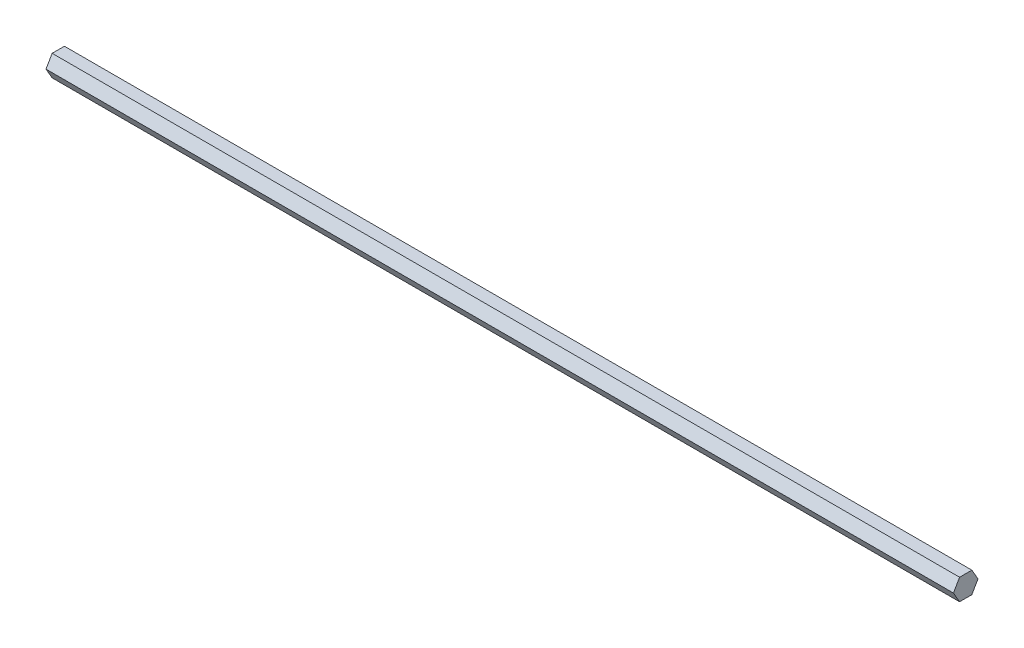
ISO-10303-21;
HEADER;
FILE_DESCRIPTION(('STEP AP214'),'2;1');
FILE_NAME('part.step','',(''),(''),'','','');
FILE_SCHEMA(('AUTOMOTIVE_DESIGN { 1 0 10303 214 1 1 1 1 }'));
ENDSEC;
DATA;
#1=APPLICATION_CONTEXT('core data for automotive mechanical design processes');
#2=APPLICATION_PROTOCOL_DEFINITION('international standard','automotive_design',2000,#1);
#3=PRODUCT_CONTEXT('',#1,'mechanical');
#4=PRODUCT('Part','Part','',(#3));
#5=PRODUCT_RELATED_PRODUCT_CATEGORY('part','',(#4));
#6=PRODUCT_DEFINITION_FORMATION('','',#4);
#7=PRODUCT_DEFINITION_CONTEXT('part definition',#1,'design');
#8=PRODUCT_DEFINITION('design','',#6,#7);
#9=PRODUCT_DEFINITION_SHAPE('','',#8);
#10=(LENGTH_UNIT() NAMED_UNIT(*) SI_UNIT(.MILLI.,.METRE.));
#11=(NAMED_UNIT(*) PLANE_ANGLE_UNIT() SI_UNIT($,.RADIAN.));
#12=(NAMED_UNIT(*) SI_UNIT($,.STERADIAN.) SOLID_ANGLE_UNIT());
#13=UNCERTAINTY_MEASURE_WITH_UNIT(LENGTH_MEASURE(1.E-05),#10,'distance_accuracy_value','');
#14=(GEOMETRIC_REPRESENTATION_CONTEXT(3) GLOBAL_UNCERTAINTY_ASSIGNED_CONTEXT((#13)) GLOBAL_UNIT_ASSIGNED_CONTEXT((#10,
#11,#12)) REPRESENTATION_CONTEXT('',''));
#15=CARTESIAN_POINT('',(0.,0.,0.));
#16=DIRECTION('',(0.,0.,1.));
#17=DIRECTION('',(1.,0.,0.));
#18=AXIS2_PLACEMENT_3D('',#15,#16,#17);
#19=CARTESIAN_POINT('',(406.4,-4.76249999999995,-2.74963065701564));
#20=DIRECTION('',(0.,0.499999999999995,0.866025403784441));
#21=DIRECTION('',(0.,-0.866025403784442,0.499999999999995));
#22=AXIS2_PLACEMENT_3D('',#19,#20,#21);
#23=PLANE('',#22);
#24=DIRECTION('',(0.,0.866025403784442,-0.499999999999995));
#25=VECTOR('',#24,1.);
#26=CARTESIAN_POINT('',(0.,-4.76249999999995,-2.74963065701564));
#27=LINE('',#26,#25);
#28=CARTESIAN_POINT('',(0.,-4.76249999999995,-2.74963065701564));
#29=VERTEX_POINT('',#28);
#30=CARTESIAN_POINT('',(0.,0.,-5.49926131403117));
#31=VERTEX_POINT('',#30);
#32=EDGE_CURVE('E120',#29,#31,#27,.T.);
#33=ORIENTED_EDGE('',*,*,#32,.T.);
#34=DIRECTION('',(-1.,0.,0.));
#35=VECTOR('',#34,1.);
#36=CARTESIAN_POINT('',(406.4,0.,-5.49926131403117));
#37=LINE('',#36,#35);
#38=CARTESIAN_POINT('',(406.4,0.,-5.49926131403117));
#39=VERTEX_POINT('',#38);
#40=EDGE_CURVE('E11',#39,#31,#37,.T.);
#41=ORIENTED_EDGE('',*,*,#40,.F.);
#42=DIRECTION('',(0.,0.866025403784442,-0.499999999999995));
#43=VECTOR('',#42,1.);
#44=CARTESIAN_POINT('',(406.4,-4.76249999999995,-2.74963065701564));
#45=LINE('',#44,#43);
#46=CARTESIAN_POINT('',(406.4,-4.76249999999995,-2.74963065701564));
#47=VERTEX_POINT('',#46);
#48=EDGE_CURVE('E130',#47,#39,#45,.T.);
#49=ORIENTED_EDGE('',*,*,#48,.F.);
#50=DIRECTION('',(-1.,0.,0.));
#51=VECTOR('',#50,1.);
#52=CARTESIAN_POINT('',(406.4,-4.76249999999995,-2.74963065701564));
#53=LINE('',#52,#51);
#54=EDGE_CURVE('E116',#47,#29,#53,.T.);
#55=ORIENTED_EDGE('',*,*,#54,.T.);
#56=EDGE_LOOP('',(#33,#41,#49,#55));
#57=FACE_BOUND('',#56,.T.);
#58=ADVANCED_FACE('F36',(#57),#23,.F.);
#59=CARTESIAN_POINT('',(406.4,0.,-5.49926131403117));
#60=DIRECTION('',(0.,-0.500000000000001,0.866025403784438));
#61=DIRECTION('',(0.,-0.866025403784438,-0.500000000000001));
#62=AXIS2_PLACEMENT_3D('',#59,#60,#61);
#63=PLANE('',#62);
#64=DIRECTION('',(0.,0.866025403784438,0.500000000000001));
#65=VECTOR('',#64,1.);
#66=CARTESIAN_POINT('',(0.,0.,-5.49926131403117));
#67=LINE('',#66,#65);
#68=CARTESIAN_POINT('',(0.,4.76249999999999,-2.74963065701557));
#69=VERTEX_POINT('',#68);
#70=EDGE_CURVE('E123',#31,#69,#67,.T.);
#71=ORIENTED_EDGE('',*,*,#70,.T.);
#72=DIRECTION('',(-1.,0.,0.));
#73=VECTOR('',#72,1.);
#74=CARTESIAN_POINT('',(406.4,4.76249999999999,-2.74963065701557));
#75=LINE('',#74,#73);
#76=CARTESIAN_POINT('',(406.4,4.76249999999999,-2.74963065701557));
#77=VERTEX_POINT('',#76);
#78=EDGE_CURVE('E44',#77,#69,#75,.T.);
#79=ORIENTED_EDGE('',*,*,#78,.F.);
#80=DIRECTION('',(0.,0.866025403784438,0.500000000000001));
#81=VECTOR('',#80,1.);
#82=CARTESIAN_POINT('',(406.4,0.,-5.49926131403117));
#83=LINE('',#82,#81);
#84=EDGE_CURVE('E89',#39,#77,#83,.T.);
#85=ORIENTED_EDGE('',*,*,#84,.F.);
#86=ORIENTED_EDGE('',*,*,#40,.T.);
#87=EDGE_LOOP('',(#71,#79,#85,#86));
#88=FACE_BOUND('',#87,.T.);
#89=ADVANCED_FACE('F154',(#88),#63,.F.);
#90=CARTESIAN_POINT('',(406.4,4.76249999999999,-2.74963065701557));
#91=DIRECTION('',(0.,-1.,0.));
#92=DIRECTION('',(0.,0.,-1.));
#93=AXIS2_PLACEMENT_3D('',#90,#91,#92);
#94=PLANE('',#93);
#95=DIRECTION('',(0.,0.,1.));
#96=VECTOR('',#95,1.);
#97=CARTESIAN_POINT('',(0.,4.76249999999999,-2.74963065701557));
#98=LINE('',#97,#96);
#99=CARTESIAN_POINT('',(0.,4.76249999999997,2.7496306570156));
#100=VERTEX_POINT('',#99);
#101=EDGE_CURVE('E125',#69,#100,#98,.T.);
#102=ORIENTED_EDGE('',*,*,#101,.T.);
#103=DIRECTION('',(-1.,0.,0.));
#104=VECTOR('',#103,1.);
#105=CARTESIAN_POINT('',(406.4,4.76249999999997,2.7496306570156));
#106=LINE('',#105,#104);
#107=CARTESIAN_POINT('',(406.4,4.76249999999997,2.7496306570156));
#108=VERTEX_POINT('',#107);
#109=EDGE_CURVE('E111',#108,#100,#106,.T.);
#110=ORIENTED_EDGE('',*,*,#109,.F.);
#111=DIRECTION('',(0.,0.,1.));
#112=VECTOR('',#111,1.);
#113=CARTESIAN_POINT('',(406.4,4.76249999999999,-2.74963065701557));
#114=LINE('',#113,#112);
#115=EDGE_CURVE('E102',#77,#108,#114,.T.);
#116=ORIENTED_EDGE('',*,*,#115,.F.);
#117=ORIENTED_EDGE('',*,*,#78,.T.);
#118=EDGE_LOOP('',(#102,#110,#116,#117));
#119=FACE_BOUND('',#118,.T.);
#120=ADVANCED_FACE('F136',(#119),#94,.F.);
#121=CARTESIAN_POINT('',(406.4,4.76249999999997,2.7496306570156));
#122=DIRECTION('',(0.,-0.499999999999995,-0.866025403784442));
#123=DIRECTION('',(0.,0.866025403784442,-0.499999999999995));
#124=AXIS2_PLACEMENT_3D('',#121,#122,#123);
#125=PLANE('',#124);
#126=DIRECTION('',(0.,-0.866025403784442,0.499999999999995));
#127=VECTOR('',#126,1.);
#128=CARTESIAN_POINT('',(0.,4.76249999999997,2.7496306570156));
#129=LINE('',#128,#127);
#130=CARTESIAN_POINT('',(0.,0.,5.49926131403117));
#131=VERTEX_POINT('',#130);
#132=EDGE_CURVE('E110',#100,#131,#129,.T.);
#133=ORIENTED_EDGE('',*,*,#132,.T.);
#134=DIRECTION('',(-1.,0.,0.));
#135=VECTOR('',#134,1.);
#136=CARTESIAN_POINT('',(406.4,0.,5.49926131403117));
#137=LINE('',#136,#135);
#138=CARTESIAN_POINT('',(406.4,0.,5.49926131403117));
#139=VERTEX_POINT('',#138);
#140=EDGE_CURVE('E107',#139,#131,#137,.T.);
#141=ORIENTED_EDGE('',*,*,#140,.F.);
#142=DIRECTION('',(0.,-0.866025403784442,0.499999999999995));
#143=VECTOR('',#142,1.);
#144=CARTESIAN_POINT('',(406.4,4.76249999999997,2.7496306570156));
#145=LINE('',#144,#143);
#146=EDGE_CURVE('E96',#108,#139,#145,.T.);
#147=ORIENTED_EDGE('',*,*,#146,.F.);
#148=ORIENTED_EDGE('',*,*,#109,.T.);
#149=EDGE_LOOP('',(#133,#141,#147,#148));
#150=FACE_BOUND('',#149,.T.);
#151=ADVANCED_FACE('F108',(#150),#125,.F.);
#152=CARTESIAN_POINT('',(406.4,0.,5.49926131403117));
#153=DIRECTION('',(0.,0.500000000000007,-0.866025403784435));
#154=DIRECTION('',(0.,0.866025403784435,0.500000000000007));
#155=AXIS2_PLACEMENT_3D('',#152,#153,#154);
#156=PLANE('',#155);
#157=DIRECTION('',(0.,-0.866025403784435,-0.500000000000007));
#158=VECTOR('',#157,1.);
#159=CARTESIAN_POINT('',(0.,0.,5.49926131403117));
#160=LINE('',#159,#158);
#161=CARTESIAN_POINT('',(0.,-4.76250000000001,2.74963065701554));
#162=VERTEX_POINT('',#161);
#163=EDGE_CURVE('E75',#131,#162,#160,.T.);
#164=ORIENTED_EDGE('',*,*,#163,.T.);
#165=DIRECTION('',(-1.,0.,0.));
#166=VECTOR('',#165,1.);
#167=CARTESIAN_POINT('',(406.4,-4.76250000000001,2.74963065701554));
#168=LINE('',#167,#166);
#169=CARTESIAN_POINT('',(406.4,-4.76250000000001,2.74963065701554));
#170=VERTEX_POINT('',#169);
#171=EDGE_CURVE('E112',#170,#162,#168,.T.);
#172=ORIENTED_EDGE('',*,*,#171,.F.);
#173=DIRECTION('',(0.,-0.866025403784435,-0.500000000000007));
#174=VECTOR('',#173,1.);
#175=CARTESIAN_POINT('',(406.4,0.,5.49926131403117));
#176=LINE('',#175,#174);
#177=EDGE_CURVE('E100',#139,#170,#176,.T.);
#178=ORIENTED_EDGE('',*,*,#177,.F.);
#179=ORIENTED_EDGE('',*,*,#140,.T.);
#180=EDGE_LOOP('',(#164,#172,#178,#179));
#181=FACE_BOUND('',#180,.T.);
#182=ADVANCED_FACE('F114',(#181),#156,.F.);
#183=CARTESIAN_POINT('',(406.4,-4.76250000000001,2.74963065701554));
#184=DIRECTION('',(0.,1.,0.));
#185=DIRECTION('',(0.,0.,1.));
#186=AXIS2_PLACEMENT_3D('',#183,#184,#185);
#187=PLANE('',#186);
#188=DIRECTION('',(0.,0.,-1.));
#189=VECTOR('',#188,1.);
#190=CARTESIAN_POINT('',(0.,-4.76250000000001,2.74963065701554));
#191=LINE('',#190,#189);
#192=EDGE_CURVE('E81',#162,#29,#191,.T.);
#193=ORIENTED_EDGE('',*,*,#192,.T.);
#194=ORIENTED_EDGE('',*,*,#54,.F.);
#195=DIRECTION('',(0.,0.,-1.));
#196=VECTOR('',#195,1.);
#197=CARTESIAN_POINT('',(406.4,-4.76250000000001,2.74963065701554));
#198=LINE('',#197,#196);
#199=EDGE_CURVE('E52',#170,#47,#198,.T.);
#200=ORIENTED_EDGE('',*,*,#199,.F.);
#201=ORIENTED_EDGE('',*,*,#171,.T.);
#202=EDGE_LOOP('',(#193,#194,#200,#201));
#203=FACE_BOUND('',#202,.T.);
#204=ADVANCED_FACE('F143',(#203),#187,.F.);
#205=CARTESIAN_POINT('',(406.4,0.,0.));
#206=DIRECTION('',(1.,0.,0.));
#207=DIRECTION('',(0.,0.,-1.));
#208=AXIS2_PLACEMENT_3D('',#205,#206,#207);
#209=PLANE('',#208);
#210=ORIENTED_EDGE('',*,*,#48,.T.);
#211=ORIENTED_EDGE('',*,*,#84,.T.);
#212=ORIENTED_EDGE('',*,*,#115,.T.);
#213=ORIENTED_EDGE('',*,*,#146,.T.);
#214=ORIENTED_EDGE('',*,*,#177,.T.);
#215=ORIENTED_EDGE('',*,*,#199,.T.);
#216=EDGE_LOOP('',(#210,#211,#212,#213,#214,#215));
#217=FACE_BOUND('',#216,.T.);
#218=ADVANCED_FACE('F98',(#217),#209,.T.);
#219=CARTESIAN_POINT('',(0.,0.,0.));
#220=DIRECTION('',(1.,0.,0.));
#221=DIRECTION('',(0.,0.,-1.));
#222=AXIS2_PLACEMENT_3D('',#219,#220,#221);
#223=PLANE('',#222);
#224=ORIENTED_EDGE('',*,*,#32,.F.);
#225=ORIENTED_EDGE('',*,*,#192,.F.);
#226=ORIENTED_EDGE('',*,*,#163,.F.);
#227=ORIENTED_EDGE('',*,*,#132,.F.);
#228=ORIENTED_EDGE('',*,*,#101,.F.);
#229=ORIENTED_EDGE('',*,*,#70,.F.);
#230=EDGE_LOOP('',(#224,#225,#226,#227,#228,#229));
#231=FACE_BOUND('',#230,.T.);
#232=ADVANCED_FACE('F139',(#231),#223,.F.);
#233=CLOSED_SHELL('',(#58,#89,#120,#151,#182,#204,#218,#232));
#234=MANIFOLD_SOLID_BREP('B2',#233);
#235=ADVANCED_BREP_SHAPE_REPRESENTATION('',(#18,#234),#14);
#236=SHAPE_DEFINITION_REPRESENTATION(#9,#235);
ENDSEC;
END-ISO-10303-21;
